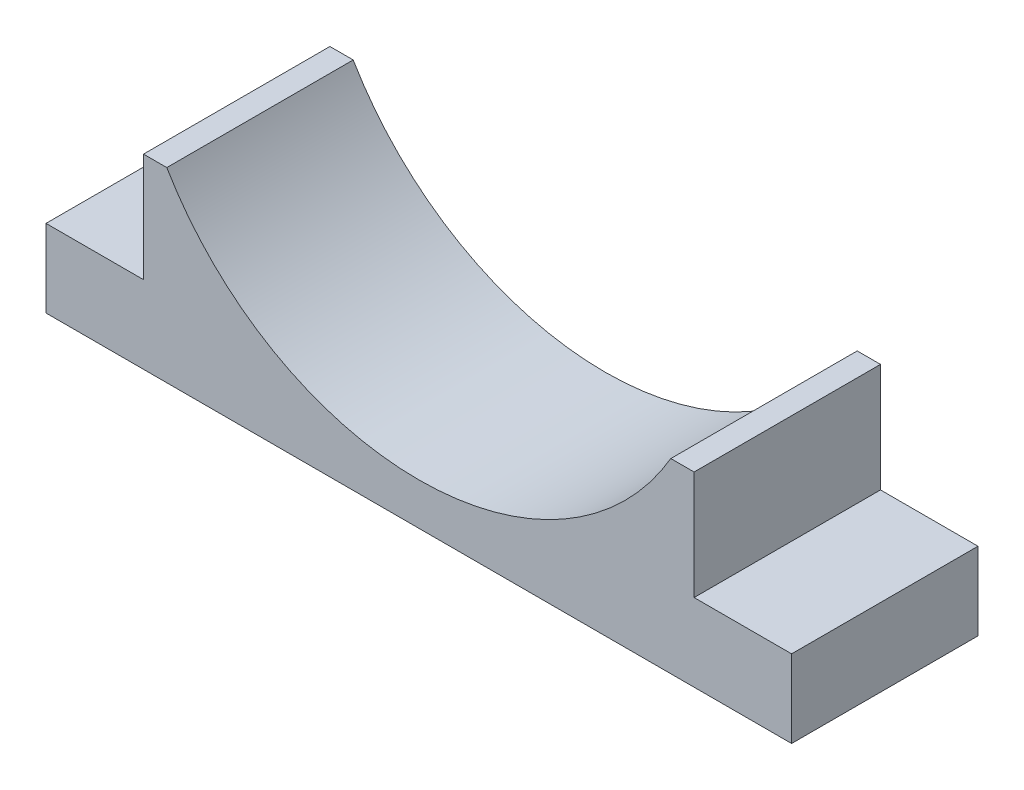
ISO-10303-21;
HEADER;
FILE_DESCRIPTION(('STEP AP214'),'2;1');
FILE_NAME('part.step','',(''),(''),'','','');
FILE_SCHEMA(('AUTOMOTIVE_DESIGN { 1 0 10303 214 1 1 1 1 }'));
ENDSEC;
DATA;
#1=APPLICATION_CONTEXT('core data for automotive mechanical design processes');
#2=APPLICATION_PROTOCOL_DEFINITION('international standard','automotive_design',2000,#1);
#3=PRODUCT_CONTEXT('',#1,'mechanical');
#4=PRODUCT('Part','Part','',(#3));
#5=PRODUCT_RELATED_PRODUCT_CATEGORY('part','',(#4));
#6=PRODUCT_DEFINITION_FORMATION('','',#4);
#7=PRODUCT_DEFINITION_CONTEXT('part definition',#1,'design');
#8=PRODUCT_DEFINITION('design','',#6,#7);
#9=PRODUCT_DEFINITION_SHAPE('','',#8);
#10=(LENGTH_UNIT() NAMED_UNIT(*) SI_UNIT(.MILLI.,.METRE.));
#11=(NAMED_UNIT(*) PLANE_ANGLE_UNIT() SI_UNIT($,.RADIAN.));
#12=(NAMED_UNIT(*) SI_UNIT($,.STERADIAN.) SOLID_ANGLE_UNIT());
#13=UNCERTAINTY_MEASURE_WITH_UNIT(LENGTH_MEASURE(1.E-05),#10,'distance_accuracy_value','');
#14=(GEOMETRIC_REPRESENTATION_CONTEXT(3) GLOBAL_UNCERTAINTY_ASSIGNED_CONTEXT((#13)) GLOBAL_UNIT_ASSIGNED_CONTEXT((#10,
#11,#12)) REPRESENTATION_CONTEXT('',''));
#15=CARTESIAN_POINT('',(0.,0.,0.));
#16=DIRECTION('',(0.,0.,1.));
#17=DIRECTION('',(1.,0.,0.));
#18=AXIS2_PLACEMENT_3D('',#15,#16,#17);
#19=CARTESIAN_POINT('',(-24.,12.,12.));
#20=DIRECTION('',(1.,0.,0.));
#21=DIRECTION('',(0.,0.,-1.));
#22=AXIS2_PLACEMENT_3D('',#19,#20,#21);
#23=PLANE('',#22);
#24=DIRECTION('',(0.,-1.,0.));
#25=VECTOR('',#24,1.);
#26=CARTESIAN_POINT('',(-24.,12.,0.));
#27=LINE('',#26,#25);
#28=CARTESIAN_POINT('',(-24.,12.,0.));
#29=VERTEX_POINT('',#28);
#30=CARTESIAN_POINT('',(-24.,7.,0.));
#31=VERTEX_POINT('',#30);
#32=EDGE_CURVE('E159',#29,#31,#27,.T.);
#33=ORIENTED_EDGE('',*,*,#32,.T.);
#34=DIRECTION('',(0.,0.,-1.));
#35=VECTOR('',#34,1.);
#36=CARTESIAN_POINT('',(-24.,7.,12.));
#37=LINE('',#36,#35);
#38=CARTESIAN_POINT('',(-24.,7.,12.));
#39=VERTEX_POINT('',#38);
#40=EDGE_CURVE('E11',#39,#31,#37,.T.);
#41=ORIENTED_EDGE('',*,*,#40,.F.);
#42=DIRECTION('',(0.,-1.,0.));
#43=VECTOR('',#42,1.);
#44=CARTESIAN_POINT('',(-24.,12.,12.));
#45=LINE('',#44,#43);
#46=CARTESIAN_POINT('',(-24.,12.,12.));
#47=VERTEX_POINT('',#46);
#48=EDGE_CURVE('E186',#47,#39,#45,.T.);
#49=ORIENTED_EDGE('',*,*,#48,.F.);
#50=DIRECTION('',(0.,0.,-1.));
#51=VECTOR('',#50,1.);
#52=CARTESIAN_POINT('',(-24.,12.,12.));
#53=LINE('',#52,#51);
#54=EDGE_CURVE('E155',#47,#29,#53,.T.);
#55=ORIENTED_EDGE('',*,*,#54,.T.);
#56=EDGE_LOOP('',(#33,#41,#49,#55));
#57=FACE_BOUND('',#56,.T.);
#58=ADVANCED_FACE('F45',(#57),#23,.F.);
#59=CARTESIAN_POINT('',(-24.,7.,12.));
#60=DIRECTION('',(0.,1.,0.));
#61=DIRECTION('',(0.,0.,1.));
#62=AXIS2_PLACEMENT_3D('',#59,#60,#61);
#63=PLANE('',#62);
#64=DIRECTION('',(1.,0.,0.));
#65=VECTOR('',#64,1.);
#66=CARTESIAN_POINT('',(-24.,7.,0.));
#67=LINE('',#66,#65);
#68=CARTESIAN_POINT('',(24.,7.,0.));
#69=VERTEX_POINT('',#68);
#70=EDGE_CURVE('E163',#31,#69,#67,.T.);
#71=ORIENTED_EDGE('',*,*,#70,.T.);
#72=DIRECTION('',(0.,0.,-1.));
#73=VECTOR('',#72,1.);
#74=CARTESIAN_POINT('',(24.,7.,12.));
#75=LINE('',#74,#73);
#76=CARTESIAN_POINT('',(24.,7.,12.));
#77=VERTEX_POINT('',#76);
#78=EDGE_CURVE('E54',#77,#69,#75,.T.);
#79=ORIENTED_EDGE('',*,*,#78,.F.);
#80=DIRECTION('',(1.,0.,0.));
#81=VECTOR('',#80,1.);
#82=CARTESIAN_POINT('',(-24.,7.,12.));
#83=LINE('',#82,#81);
#84=EDGE_CURVE('E111',#39,#77,#83,.T.);
#85=ORIENTED_EDGE('',*,*,#84,.F.);
#86=ORIENTED_EDGE('',*,*,#40,.T.);
#87=EDGE_LOOP('',(#71,#79,#85,#86));
#88=FACE_BOUND('',#87,.T.);
#89=ADVANCED_FACE('F250',(#88),#63,.F.);
#90=CARTESIAN_POINT('',(24.,7.,12.));
#91=DIRECTION('',(-1.,0.,0.));
#92=DIRECTION('',(0.,0.,1.));
#93=AXIS2_PLACEMENT_3D('',#90,#91,#92);
#94=PLANE('',#93);
#95=DIRECTION('',(0.,1.,0.));
#96=VECTOR('',#95,1.);
#97=CARTESIAN_POINT('',(24.,7.,0.));
#98=LINE('',#97,#96);
#99=CARTESIAN_POINT('',(24.,12.,0.));
#100=VERTEX_POINT('',#99);
#101=EDGE_CURVE('E166',#69,#100,#98,.T.);
#102=ORIENTED_EDGE('',*,*,#101,.T.);
#103=DIRECTION('',(0.,0.,-1.));
#104=VECTOR('',#103,1.);
#105=CARTESIAN_POINT('',(24.,12.,12.));
#106=LINE('',#105,#104);
#107=CARTESIAN_POINT('',(24.,12.,12.));
#108=VERTEX_POINT('',#107);
#109=EDGE_CURVE('E205',#108,#100,#106,.T.);
#110=ORIENTED_EDGE('',*,*,#109,.F.);
#111=DIRECTION('',(0.,1.,0.));
#112=VECTOR('',#111,1.);
#113=CARTESIAN_POINT('',(24.,7.,12.));
#114=LINE('',#113,#112);
#115=EDGE_CURVE('E216',#77,#108,#114,.T.);
#116=ORIENTED_EDGE('',*,*,#115,.F.);
#117=ORIENTED_EDGE('',*,*,#78,.T.);
#118=EDGE_LOOP('',(#102,#110,#116,#117));
#119=FACE_BOUND('',#118,.T.);
#120=ADVANCED_FACE('F214',(#119),#94,.F.);
#121=CARTESIAN_POINT('',(24.,12.,12.));
#122=DIRECTION('',(0.,-1.,0.));
#123=DIRECTION('',(0.,0.,-1.));
#124=AXIS2_PLACEMENT_3D('',#121,#122,#123);
#125=PLANE('',#124);
#126=DIRECTION('',(-1.,0.,0.));
#127=VECTOR('',#126,1.);
#128=CARTESIAN_POINT('',(24.,12.,0.));
#129=LINE('',#128,#127);
#130=CARTESIAN_POINT('',(17.723131634,12.,0.));
#131=VERTEX_POINT('',#130);
#132=EDGE_CURVE('E168',#100,#131,#129,.T.);
#133=ORIENTED_EDGE('',*,*,#132,.T.);
#134=DIRECTION('',(0.,0.,-1.));
#135=VECTOR('',#134,1.);
#136=CARTESIAN_POINT('',(17.723131634,12.,12.));
#137=LINE('',#136,#135);
#138=CARTESIAN_POINT('',(17.723131634,12.,12.));
#139=VERTEX_POINT('',#138);
#140=EDGE_CURVE('E201',#139,#131,#137,.T.);
#141=ORIENTED_EDGE('',*,*,#140,.F.);
#142=DIRECTION('',(-1.,0.,0.));
#143=VECTOR('',#142,1.);
#144=CARTESIAN_POINT('',(24.,12.,12.));
#145=LINE('',#144,#143);
#146=EDGE_CURVE('E234',#108,#139,#145,.T.);
#147=ORIENTED_EDGE('',*,*,#146,.F.);
#148=ORIENTED_EDGE('',*,*,#109,.T.);
#149=EDGE_LOOP('',(#133,#141,#147,#148));
#150=FACE_BOUND('',#149,.T.);
#151=ADVANCED_FACE('F225',(#150),#125,.F.);
#152=CARTESIAN_POINT('',(17.723131634,12.,12.));
#153=DIRECTION('',(-1.,0.,0.));
#154=DIRECTION('',(0.,0.,1.));
#155=AXIS2_PLACEMENT_3D('',#152,#153,#154);
#156=PLANE('',#155);
#157=DIRECTION('',(0.,1.,0.));
#158=VECTOR('',#157,1.);
#159=CARTESIAN_POINT('',(17.723131634,12.,0.));
#160=LINE('',#159,#158);
#161=CARTESIAN_POINT('',(17.723131634,19.,0.));
#162=VERTEX_POINT('',#161);
#163=EDGE_CURVE('E171',#131,#162,#160,.T.);
#164=ORIENTED_EDGE('',*,*,#163,.T.);
#165=DIRECTION('',(0.,0.,-1.));
#166=VECTOR('',#165,1.);
#167=CARTESIAN_POINT('',(17.723131634,19.,12.));
#168=LINE('',#167,#166);
#169=CARTESIAN_POINT('',(17.723131634,19.,12.));
#170=VERTEX_POINT('',#169);
#171=EDGE_CURVE('E197',#170,#162,#168,.T.);
#172=ORIENTED_EDGE('',*,*,#171,.F.);
#173=DIRECTION('',(0.,1.,0.));
#174=VECTOR('',#173,1.);
#175=CARTESIAN_POINT('',(17.723131634,12.,12.));
#176=LINE('',#175,#174);
#177=EDGE_CURVE('E231',#139,#170,#176,.T.);
#178=ORIENTED_EDGE('',*,*,#177,.F.);
#179=ORIENTED_EDGE('',*,*,#140,.T.);
#180=EDGE_LOOP('',(#164,#172,#178,#179));
#181=FACE_BOUND('',#180,.T.);
#182=ADVANCED_FACE('F229',(#181),#156,.F.);
#183=CARTESIAN_POINT('',(17.723131634,19.,12.));
#184=DIRECTION('',(0.,-1.,0.));
#185=DIRECTION('',(0.,0.,-1.));
#186=AXIS2_PLACEMENT_3D('',#183,#184,#185);
#187=PLANE('',#186);
#188=DIRECTION('',(-1.,0.,0.));
#189=VECTOR('',#188,1.);
#190=CARTESIAN_POINT('',(17.723131634,19.,0.));
#191=LINE('',#190,#189);
#192=CARTESIAN_POINT('',(16.223131634,19.,0.));
#193=VERTEX_POINT('',#192);
#194=EDGE_CURVE('E174',#162,#193,#191,.T.);
#195=ORIENTED_EDGE('',*,*,#194,.T.);
#196=DIRECTION('',(0.,0.,-1.));
#197=VECTOR('',#196,1.);
#198=CARTESIAN_POINT('',(16.223131634,19.,12.));
#199=LINE('',#198,#197);
#200=CARTESIAN_POINT('',(16.223131634,19.,12.));
#201=VERTEX_POINT('',#200);
#202=EDGE_CURVE('E193',#201,#193,#199,.T.);
#203=ORIENTED_EDGE('',*,*,#202,.F.);
#204=DIRECTION('',(-1.,0.,0.));
#205=VECTOR('',#204,1.);
#206=CARTESIAN_POINT('',(17.723131634,19.,12.));
#207=LINE('',#206,#205);
#208=EDGE_CURVE('E233',#170,#201,#207,.T.);
#209=ORIENTED_EDGE('',*,*,#208,.F.);
#210=ORIENTED_EDGE('',*,*,#171,.T.);
#211=EDGE_LOOP('',(#195,#203,#209,#210));
#212=FACE_BOUND('',#211,.T.);
#213=ADVANCED_FACE('F261',(#212),#187,.F.);
#214=CARTESIAN_POINT('',(0.,28.5000000007576,12.));
#215=DIRECTION('',(0.,0.,-1.));
#216=DIRECTION('',(-1.,0.,0.));
#217=AXIS2_PLACEMENT_3D('',#214,#215,#216);
#218=CYLINDRICAL_SURFACE('',#217,18.8000000007576);
#219=CARTESIAN_POINT('',(0.,28.5000000007576,0.));
#220=DIRECTION('',(0.,0.,-1.));
#221=DIRECTION('',(-1.,0.,0.));
#222=AXIS2_PLACEMENT_3D('',#219,#220,#221);
#223=CIRCLE('',#222,18.8000000007576);
#224=CARTESIAN_POINT('',(-16.223131634,19.,0.));
#225=VERTEX_POINT('',#224);
#226=EDGE_CURVE('E177',#193,#225,#223,.T.);
#227=ORIENTED_EDGE('',*,*,#226,.T.);
#228=DIRECTION('',(0.,0.,-1.));
#229=VECTOR('',#228,1.);
#230=CARTESIAN_POINT('',(-16.223131634,19.,12.));
#231=LINE('',#230,#229);
#232=CARTESIAN_POINT('',(-16.223131634,19.,12.));
#233=VERTEX_POINT('',#232);
#234=EDGE_CURVE('E147',#233,#225,#231,.T.);
#235=ORIENTED_EDGE('',*,*,#234,.F.);
#236=CARTESIAN_POINT('',(0.,28.5000000007576,12.));
#237=DIRECTION('',(0.,0.,-1.));
#238=DIRECTION('',(-1.,0.,0.));
#239=AXIS2_PLACEMENT_3D('',#236,#237,#238);
#240=CIRCLE('',#239,18.8000000007576);
#241=EDGE_CURVE('E136',#201,#233,#240,.T.);
#242=ORIENTED_EDGE('',*,*,#241,.F.);
#243=ORIENTED_EDGE('',*,*,#202,.T.);
#244=EDGE_LOOP('',(#227,#235,#242,#243));
#245=FACE_BOUND('',#244,.T.);
#246=ADVANCED_FACE('F264',(#245),#218,.F.);
#247=CARTESIAN_POINT('',(-16.223131634,19.,12.));
#248=DIRECTION('',(0.,-1.,0.));
#249=DIRECTION('',(0.,0.,-1.));
#250=AXIS2_PLACEMENT_3D('',#247,#248,#249);
#251=PLANE('',#250);
#252=DIRECTION('',(-1.,0.,0.));
#253=VECTOR('',#252,1.);
#254=CARTESIAN_POINT('',(-16.223131634,19.,0.));
#255=LINE('',#254,#253);
#256=CARTESIAN_POINT('',(-17.723131634,19.,0.));
#257=VERTEX_POINT('',#256);
#258=EDGE_CURVE('E145',#225,#257,#255,.T.);
#259=ORIENTED_EDGE('',*,*,#258,.T.);
#260=DIRECTION('',(0.,0.,-1.));
#261=VECTOR('',#260,1.);
#262=CARTESIAN_POINT('',(-17.723131634,19.,12.));
#263=LINE('',#262,#261);
#264=CARTESIAN_POINT('',(-17.723131634,19.,12.));
#265=VERTEX_POINT('',#264);
#266=EDGE_CURVE('E142',#265,#257,#263,.T.);
#267=ORIENTED_EDGE('',*,*,#266,.F.);
#268=DIRECTION('',(-1.,0.,0.));
#269=VECTOR('',#268,1.);
#270=CARTESIAN_POINT('',(-16.223131634,19.,12.));
#271=LINE('',#270,#269);
#272=EDGE_CURVE('E130',#233,#265,#271,.T.);
#273=ORIENTED_EDGE('',*,*,#272,.F.);
#274=ORIENTED_EDGE('',*,*,#234,.T.);
#275=EDGE_LOOP('',(#259,#267,#273,#274));
#276=FACE_BOUND('',#275,.T.);
#277=ADVANCED_FACE('F143',(#276),#251,.F.);
#278=CARTESIAN_POINT('',(-17.723131634,19.,12.));
#279=DIRECTION('',(1.,0.,0.));
#280=DIRECTION('',(0.,0.,-1.));
#281=AXIS2_PLACEMENT_3D('',#278,#279,#280);
#282=PLANE('',#281);
#283=DIRECTION('',(0.,-1.,0.));
#284=VECTOR('',#283,1.);
#285=CARTESIAN_POINT('',(-17.723131634,19.,0.));
#286=LINE('',#285,#284);
#287=CARTESIAN_POINT('',(-17.723131634,12.,0.));
#288=VERTEX_POINT('',#287);
#289=EDGE_CURVE('E97',#257,#288,#286,.T.);
#290=ORIENTED_EDGE('',*,*,#289,.T.);
#291=DIRECTION('',(0.,0.,-1.));
#292=VECTOR('',#291,1.);
#293=CARTESIAN_POINT('',(-17.723131634,12.,12.));
#294=LINE('',#293,#292);
#295=CARTESIAN_POINT('',(-17.723131634,12.,12.));
#296=VERTEX_POINT('',#295);
#297=EDGE_CURVE('E148',#296,#288,#294,.T.);
#298=ORIENTED_EDGE('',*,*,#297,.F.);
#299=DIRECTION('',(0.,-1.,0.));
#300=VECTOR('',#299,1.);
#301=CARTESIAN_POINT('',(-17.723131634,19.,12.));
#302=LINE('',#301,#300);
#303=EDGE_CURVE('E134',#265,#296,#302,.T.);
#304=ORIENTED_EDGE('',*,*,#303,.F.);
#305=ORIENTED_EDGE('',*,*,#266,.T.);
#306=EDGE_LOOP('',(#290,#298,#304,#305));
#307=FACE_BOUND('',#306,.T.);
#308=ADVANCED_FACE('F150',(#307),#282,.F.);
#309=CARTESIAN_POINT('',(-17.723131634,12.,12.));
#310=DIRECTION('',(0.,-1.,0.));
#311=DIRECTION('',(0.,0.,-1.));
#312=AXIS2_PLACEMENT_3D('',#309,#310,#311);
#313=PLANE('',#312);
#314=DIRECTION('',(-1.,0.,0.));
#315=VECTOR('',#314,1.);
#316=CARTESIAN_POINT('',(-17.723131634,12.,0.));
#317=LINE('',#316,#315);
#318=EDGE_CURVE('E103',#288,#29,#317,.T.);
#319=ORIENTED_EDGE('',*,*,#318,.T.);
#320=ORIENTED_EDGE('',*,*,#54,.F.);
#321=DIRECTION('',(-1.,0.,0.));
#322=VECTOR('',#321,1.);
#323=CARTESIAN_POINT('',(-17.723131634,12.,12.));
#324=LINE('',#323,#322);
#325=EDGE_CURVE('E62',#296,#47,#324,.T.);
#326=ORIENTED_EDGE('',*,*,#325,.F.);
#327=ORIENTED_EDGE('',*,*,#297,.T.);
#328=EDGE_LOOP('',(#319,#320,#326,#327));
#329=FACE_BOUND('',#328,.T.);
#330=ADVANCED_FACE('F273',(#329),#313,.F.);
#331=CARTESIAN_POINT('',(0.,28.5000000007576,12.));
#332=DIRECTION('',(0.,0.,-1.));
#333=DIRECTION('',(-1.,0.,0.));
#334=AXIS2_PLACEMENT_3D('',#331,#332,#333);
#335=PLANE('',#334);
#336=ORIENTED_EDGE('',*,*,#48,.T.);
#337=ORIENTED_EDGE('',*,*,#84,.T.);
#338=ORIENTED_EDGE('',*,*,#115,.T.);
#339=ORIENTED_EDGE('',*,*,#146,.T.);
#340=ORIENTED_EDGE('',*,*,#177,.T.);
#341=ORIENTED_EDGE('',*,*,#208,.T.);
#342=ORIENTED_EDGE('',*,*,#241,.T.);
#343=ORIENTED_EDGE('',*,*,#272,.T.);
#344=ORIENTED_EDGE('',*,*,#303,.T.);
#345=ORIENTED_EDGE('',*,*,#325,.T.);
#346=EDGE_LOOP('',(#336,#337,#338,#339,#340,#341,#342,#343,#344,#345));
#347=FACE_BOUND('',#346,.T.);
#348=ADVANCED_FACE('F132',(#347),#335,.F.);
#349=CARTESIAN_POINT('',(0.,28.5000000007576,0.));
#350=DIRECTION('',(0.,0.,-1.));
#351=DIRECTION('',(-1.,0.,0.));
#352=AXIS2_PLACEMENT_3D('',#349,#350,#351);
#353=PLANE('',#352);
#354=ORIENTED_EDGE('',*,*,#32,.F.);
#355=ORIENTED_EDGE('',*,*,#318,.F.);
#356=ORIENTED_EDGE('',*,*,#289,.F.);
#357=ORIENTED_EDGE('',*,*,#258,.F.);
#358=ORIENTED_EDGE('',*,*,#226,.F.);
#359=ORIENTED_EDGE('',*,*,#194,.F.);
#360=ORIENTED_EDGE('',*,*,#163,.F.);
#361=ORIENTED_EDGE('',*,*,#132,.F.);
#362=ORIENTED_EDGE('',*,*,#101,.F.);
#363=ORIENTED_EDGE('',*,*,#70,.F.);
#364=EDGE_LOOP('',(#354,#355,#356,#357,#358,#359,#360,#361,#362,#363));
#365=FACE_BOUND('',#364,.T.);
#366=ADVANCED_FACE('F220',(#365),#353,.T.);
#367=CLOSED_SHELL('',(#58,#89,#120,#151,#182,#213,#246,#277,#308,#330,#348,#366));
#368=MANIFOLD_SOLID_BREP('B2',#367);
#369=ADVANCED_BREP_SHAPE_REPRESENTATION('',(#18,#368),#14);
#370=SHAPE_DEFINITION_REPRESENTATION(#9,#369);
ENDSEC;
END-ISO-10303-21;
